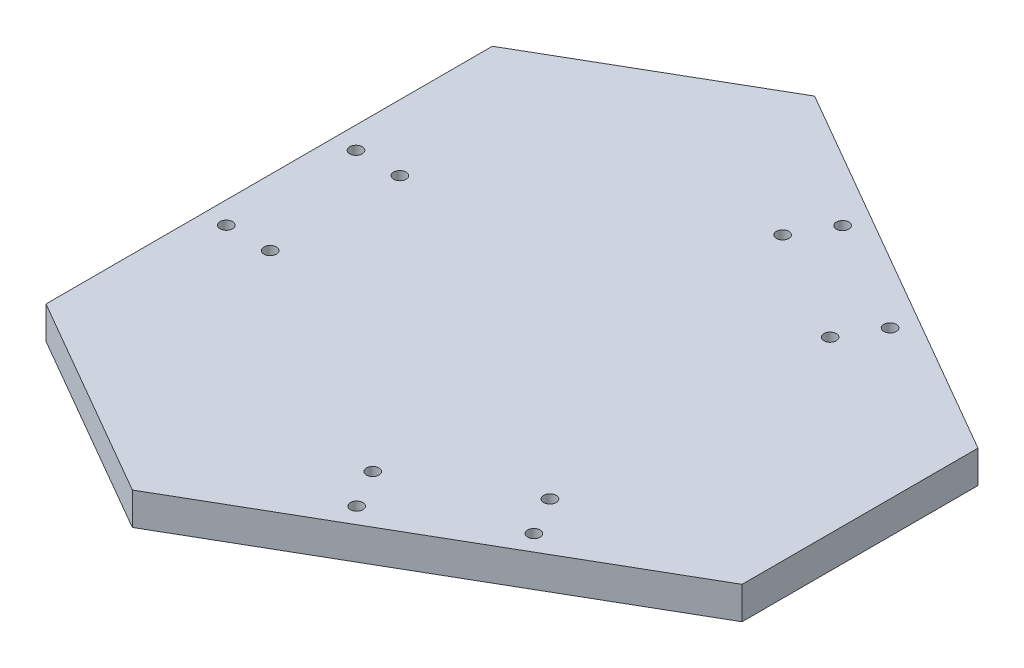
ISO-10303-21;
HEADER;
FILE_DESCRIPTION(('STEP AP214'),'2;1');
FILE_NAME('part.step','',(''),(''),'','','');
FILE_SCHEMA(('AUTOMOTIVE_DESIGN { 1 0 10303 214 1 1 1 1 }'));
ENDSEC;
DATA;
#1=APPLICATION_CONTEXT('core data for automotive mechanical design processes');
#2=APPLICATION_PROTOCOL_DEFINITION('international standard','automotive_design',2000,#1);
#3=PRODUCT_CONTEXT('',#1,'mechanical');
#4=PRODUCT('Part','Part','',(#3));
#5=PRODUCT_RELATED_PRODUCT_CATEGORY('part','',(#4));
#6=PRODUCT_DEFINITION_FORMATION('','',#4);
#7=PRODUCT_DEFINITION_CONTEXT('part definition',#1,'design');
#8=PRODUCT_DEFINITION('design','',#6,#7);
#9=PRODUCT_DEFINITION_SHAPE('','',#8);
#10=(LENGTH_UNIT() NAMED_UNIT(*) SI_UNIT(.MILLI.,.METRE.));
#11=(NAMED_UNIT(*) PLANE_ANGLE_UNIT() SI_UNIT($,.RADIAN.));
#12=(NAMED_UNIT(*) SI_UNIT($,.STERADIAN.) SOLID_ANGLE_UNIT());
#13=UNCERTAINTY_MEASURE_WITH_UNIT(LENGTH_MEASURE(1.E-05),#10,'distance_accuracy_value','');
#14=(GEOMETRIC_REPRESENTATION_CONTEXT(3) GLOBAL_UNCERTAINTY_ASSIGNED_CONTEXT((#13)) GLOBAL_UNIT_ASSIGNED_CONTEXT((#10,
#11,#12)) REPRESENTATION_CONTEXT('',''));
#15=CARTESIAN_POINT('',(0.,0.,0.));
#16=DIRECTION('',(0.,0.,1.));
#17=DIRECTION('',(1.,0.,0.));
#18=AXIS2_PLACEMENT_3D('',#15,#16,#17);
#19=CARTESIAN_POINT('',(0.,12.7,0.));
#20=DIRECTION('',(0.,-1.,0.));
#21=DIRECTION('',(0.,0.,-1.));
#22=AXIS2_PLACEMENT_3D('',#19,#20,#21);
#23=PLANE('',#22);
#24=DIRECTION('',(-0.866025403784441,0.,-0.499999999999996));
#25=VECTOR('',#24,1.);
#26=CARTESIAN_POINT('',(-23.7919903784448,12.7,-133.584979218994));
#27=LINE('',#26,#25);
#28=CARTESIAN_POINT('',(127.583980756887,12.7,-46.1880215351699));
#29=VERTEX_POINT('',#28);
#30=CARTESIAN_POINT('',(-23.7919903784448,12.7,-133.584979218994));
#31=VERTEX_POINT('',#30);
#32=EDGE_CURVE('E152',#29,#31,#27,.T.);
#33=ORIENTED_EDGE('',*,*,#32,.T.);
#34=DIRECTION('',(-0.866025403784434,0.,0.500000000000007));
#35=VECTOR('',#34,1.);
#36=CARTESIAN_POINT('',(-23.7919903784448,12.7,-133.584979218994));
#37=LINE('',#36,#35);
#38=CARTESIAN_POINT('',(-103.791990378444,12.7,-87.3969576838233));
#39=VERTEX_POINT('',#38);
#40=EDGE_CURVE('E100',#31,#39,#37,.T.);
#41=ORIENTED_EDGE('',*,*,#40,.T.);
#42=DIRECTION('',(0.,0.,1.));
#43=VECTOR('',#42,1.);
#44=CARTESIAN_POINT('',(-103.791990378444,12.7,-87.3969576838233));
#45=LINE('',#44,#43);
#46=CARTESIAN_POINT('',(-103.791990378443,12.7,87.3969576838251));
#47=VERTEX_POINT('',#46);
#48=EDGE_CURVE('E113',#39,#47,#45,.T.);
#49=ORIENTED_EDGE('',*,*,#48,.T.);
#50=DIRECTION('',(0.866025403784443,0.,0.499999999999992));
#51=VECTOR('',#50,1.);
#52=CARTESIAN_POINT('',(-103.791990378443,12.7,87.3969576838251));
#53=LINE('',#52,#51);
#54=CARTESIAN_POINT('',(-23.7919903784425,12.7,133.584979218994));
#55=VERTEX_POINT('',#54);
#56=EDGE_CURVE('E107',#47,#55,#53,.T.);
#57=ORIENTED_EDGE('',*,*,#56,.T.);
#58=DIRECTION('',(0.866025403784436,0.,-0.500000000000004));
#59=VECTOR('',#58,1.);
#60=CARTESIAN_POINT('',(-23.7919903784425,12.7,133.584979218994));
#61=LINE('',#60,#59);
#62=CARTESIAN_POINT('',(127.583980756887,12.7,46.1880215351699));
#63=VERTEX_POINT('',#62);
#64=EDGE_CURVE('E111',#55,#63,#61,.T.);
#65=ORIENTED_EDGE('',*,*,#64,.T.);
#66=DIRECTION('',(0.,0.,-1.));
#67=VECTOR('',#66,1.);
#68=CARTESIAN_POINT('',(127.583980756887,12.7,-46.1880215351699));
#69=LINE('',#68,#67);
#70=EDGE_CURVE('E63',#63,#29,#69,.T.);
#71=ORIENTED_EDGE('',*,*,#70,.T.);
#72=EDGE_LOOP('',(#33,#41,#49,#57,#65,#71));
#73=FACE_BOUND('',#72,.T.);
#74=CARTESIAN_POINT('',(69.5963939228782,12.7,69.7451759231105));
#75=DIRECTION('',(0.,1.,0.));
#76=DIRECTION('',(0.,0.,1.));
#77=AXIS2_PLACEMENT_3D('',#74,#75,#76);
#78=CIRCLE('',#77,2.4511);
#79=CARTESIAN_POINT('',(69.5963939228782,12.7,72.1962759231105));
#80=VERTEX_POINT('',#79);
#81=EDGE_CURVE('E140',#80,#80,#78,.T.);
#82=ORIENTED_EDGE('',*,*,#81,.F.);
#83=EDGE_LOOP('',(#82));
#84=FACE_BOUND('',#83,.T.);
#85=CARTESIAN_POINT('',(25.6028971793903,12.7,95.1448331105564));
#86=DIRECTION('',(0.,1.,0.));
#87=DIRECTION('',(0.,0.,-1.));
#88=AXIS2_PLACEMENT_3D('',#85,#86,#87);
#89=CIRCLE('',#88,2.4511);
#90=CARTESIAN_POINT('',(25.6028971793903,12.7,92.6937331105564));
#91=VERTEX_POINT('',#90);
#92=EDGE_CURVE('E320',#91,#91,#89,.T.);
#93=ORIENTED_EDGE('',*,*,#92,.F.);
#94=EDGE_LOOP('',(#93));
#95=FACE_BOUND('',#94,.T.);
#96=CARTESIAN_POINT('',(60.9996431990551,12.7,54.8551668894447));
#97=DIRECTION('',(0.,1.,0.));
#98=DIRECTION('',(0.,0.,-1.));
#99=AXIS2_PLACEMENT_3D('',#96,#97,#98);
#100=CIRCLE('',#99,2.4511);
#101=CARTESIAN_POINT('',(60.9996431990551,12.7,52.4040668894447));
#102=VERTEX_POINT('',#101);
#103=EDGE_CURVE('E312',#102,#102,#100,.T.);
#104=ORIENTED_EDGE('',*,*,#103,.F.);
#105=EDGE_LOOP('',(#104));
#106=FACE_BOUND('',#105,.T.);
#107=CARTESIAN_POINT('',(17.0061464555673,12.7,80.2548240768907));
#108=DIRECTION('',(0.,1.,0.));
#109=DIRECTION('',(0.,0.,1.));
#110=AXIS2_PLACEMENT_3D('',#107,#108,#109);
#111=CIRCLE('',#110,2.4511);
#112=CARTESIAN_POINT('',(17.0061464555673,12.7,82.7059240768907));
#113=VERTEX_POINT('',#112);
#114=EDGE_CURVE('E304',#113,#113,#111,.T.);
#115=ORIENTED_EDGE('',*,*,#114,.F.);
#116=EDGE_LOOP('',(#115));
#117=FACE_BOUND('',#116,.T.);
#118=CARTESIAN_POINT('',(-78.0057896546217,12.7,25.3996571874461));
#119=DIRECTION('',(0.,1.,0.));
#120=DIRECTION('',(0.,0.,-1.));
#121=AXIS2_PLACEMENT_3D('',#118,#119,#120);
#122=CIRCLE('',#121,2.4511);
#123=CARTESIAN_POINT('',(-78.0057896546217,12.7,22.9485571874461));
#124=VERTEX_POINT('',#123);
#125=EDGE_CURVE('E296',#124,#124,#122,.T.);
#126=ORIENTED_EDGE('',*,*,#125,.F.);
#127=EDGE_LOOP('',(#126));
#128=FACE_BOUND('',#127,.T.);
#129=CARTESIAN_POINT('',(-95.1992911022676,12.7,25.3996571874461));
#130=DIRECTION('',(0.,1.,0.));
#131=DIRECTION('',(0.,0.,1.));
#132=AXIS2_PLACEMENT_3D('',#129,#130,#131);
#133=CIRCLE('',#132,2.4511);
#134=CARTESIAN_POINT('',(-95.1992911022676,12.7,27.8507571874461));
#135=VERTEX_POINT('',#134);
#136=EDGE_CURVE('E288',#135,#135,#133,.T.);
#137=ORIENTED_EDGE('',*,*,#136,.F.);
#138=EDGE_LOOP('',(#137));
#139=FACE_BOUND('',#138,.T.);
#140=CARTESIAN_POINT('',(-95.1992911022678,12.7,-25.3996571874453));
#141=DIRECTION('',(0.,1.,0.));
#142=DIRECTION('',(0.,0.,-1.));
#143=AXIS2_PLACEMENT_3D('',#140,#141,#142);
#144=CIRCLE('',#143,2.4511);
#145=CARTESIAN_POINT('',(-95.1992911022678,12.7,-27.8507571874453));
#146=VERTEX_POINT('',#145);
#147=EDGE_CURVE('E280',#146,#146,#144,.T.);
#148=ORIENTED_EDGE('',*,*,#147,.F.);
#149=EDGE_LOOP('',(#148));
#150=FACE_BOUND('',#149,.T.);
#151=CARTESIAN_POINT('',(-78.0057896546219,12.7,-25.3996571874453));
#152=DIRECTION('',(0.,1.,0.));
#153=DIRECTION('',(0.,0.,1.));
#154=AXIS2_PLACEMENT_3D('',#151,#152,#153);
#155=CIRCLE('',#154,2.4511);
#156=CARTESIAN_POINT('',(-78.0057896546219,12.7,-22.9485571874453));
#157=VERTEX_POINT('',#156);
#158=EDGE_CURVE('E272',#157,#157,#155,.T.);
#159=ORIENTED_EDGE('',*,*,#158,.F.);
#160=EDGE_LOOP('',(#159));
#161=FACE_BOUND('',#160,.T.);
#162=CARTESIAN_POINT('',(60.9996431990543,12.7,-54.8551668894456));
#163=DIRECTION('',(0.,1.,0.));
#164=DIRECTION('',(0.,0.,1.));
#165=AXIS2_PLACEMENT_3D('',#162,#163,#164);
#166=CIRCLE('',#165,2.4511);
#167=CARTESIAN_POINT('',(60.9996431990543,12.7,-52.4040668894456));
#168=VERTEX_POINT('',#167);
#169=EDGE_CURVE('E264',#168,#168,#166,.T.);
#170=ORIENTED_EDGE('',*,*,#169,.F.);
#171=EDGE_LOOP('',(#170));
#172=FACE_BOUND('',#171,.T.);
#173=CARTESIAN_POINT('',(69.5963939228772,12.7,-69.7451759231115));
#174=DIRECTION('',(0.,1.,0.));
#175=DIRECTION('',(0.,0.,-1.));
#176=AXIS2_PLACEMENT_3D('',#173,#174,#175);
#177=CIRCLE('',#176,2.4511);
#178=CARTESIAN_POINT('',(69.5963939228772,12.7,-72.1962759231115));
#179=VERTEX_POINT('',#178);
#180=EDGE_CURVE('E256',#179,#179,#177,.T.);
#181=ORIENTED_EDGE('',*,*,#180,.F.);
#182=EDGE_LOOP('',(#181));
#183=FACE_BOUND('',#182,.T.);
#184=CARTESIAN_POINT('',(25.602897179389,12.7,-95.1448331105568));
#185=DIRECTION('',(0.,1.,0.));
#186=DIRECTION('',(0.,0.,1.));
#187=AXIS2_PLACEMENT_3D('',#184,#185,#186);
#188=CIRCLE('',#187,2.4511);
#189=CARTESIAN_POINT('',(25.602897179389,12.7,-92.6937331105568));
#190=VERTEX_POINT('',#189);
#191=EDGE_CURVE('E248',#190,#190,#188,.T.);
#192=ORIENTED_EDGE('',*,*,#191,.F.);
#193=EDGE_LOOP('',(#192));
#194=FACE_BOUND('',#193,.T.);
#195=CARTESIAN_POINT('',(17.0061464555662,12.7,-80.2548240768909));
#196=DIRECTION('',(0.,1.,0.));
#197=DIRECTION('',(0.,0.,-1.));
#198=AXIS2_PLACEMENT_3D('',#195,#196,#197);
#199=CIRCLE('',#198,2.4511);
#200=CARTESIAN_POINT('',(17.0061464555662,12.7,-82.7059240768909));
#201=VERTEX_POINT('',#200);
#202=EDGE_CURVE('E237',#201,#201,#199,.T.);
#203=ORIENTED_EDGE('',*,*,#202,.F.);
#204=EDGE_LOOP('',(#203));
#205=FACE_BOUND('',#204,.T.);
#206=ADVANCED_FACE('F45',(#73,#84,#95,#106,#117,#128,#139,#150,#161,#172,#183,#194,#205),#23,.F.);
#207=CARTESIAN_POINT('',(0.,0.,0.));
#208=DIRECTION('',(0.,-1.,0.));
#209=DIRECTION('',(0.,0.,-1.));
#210=AXIS2_PLACEMENT_3D('',#207,#208,#209);
#211=PLANE('',#210);
#212=CARTESIAN_POINT('',(25.602897179389,0.,-95.1448331105568));
#213=DIRECTION('',(0.,1.,0.));
#214=DIRECTION('',(0.,0.,1.));
#215=AXIS2_PLACEMENT_3D('',#212,#213,#214);
#216=CIRCLE('',#215,2.4511);
#217=CARTESIAN_POINT('',(25.602897179389,0.,-92.6937331105568));
#218=VERTEX_POINT('',#217);
#219=EDGE_CURVE('E245',#218,#218,#216,.T.);
#220=ORIENTED_EDGE('',*,*,#219,.T.);
#221=EDGE_LOOP('',(#220));
#222=FACE_BOUND('',#221,.T.);
#223=CARTESIAN_POINT('',(60.9996431990543,0.,-54.8551668894456));
#224=DIRECTION('',(0.,1.,0.));
#225=DIRECTION('',(0.,0.,1.));
#226=AXIS2_PLACEMENT_3D('',#223,#224,#225);
#227=CIRCLE('',#226,2.4511);
#228=CARTESIAN_POINT('',(60.9996431990543,0.,-52.4040668894456));
#229=VERTEX_POINT('',#228);
#230=EDGE_CURVE('E260',#229,#229,#227,.T.);
#231=ORIENTED_EDGE('',*,*,#230,.T.);
#232=EDGE_LOOP('',(#231));
#233=FACE_BOUND('',#232,.T.);
#234=CARTESIAN_POINT('',(-95.1992911022678,0.,-25.3996571874453));
#235=DIRECTION('',(0.,1.,0.));
#236=DIRECTION('',(0.,0.,-1.));
#237=AXIS2_PLACEMENT_3D('',#234,#235,#236);
#238=CIRCLE('',#237,2.4511);
#239=CARTESIAN_POINT('',(-95.1992911022678,0.,-27.8507571874453));
#240=VERTEX_POINT('',#239);
#241=EDGE_CURVE('E276',#240,#240,#238,.T.);
#242=ORIENTED_EDGE('',*,*,#241,.T.);
#243=EDGE_LOOP('',(#242));
#244=FACE_BOUND('',#243,.T.);
#245=CARTESIAN_POINT('',(-78.0057896546217,0.,25.3996571874461));
#246=DIRECTION('',(0.,1.,0.));
#247=DIRECTION('',(0.,0.,-1.));
#248=AXIS2_PLACEMENT_3D('',#245,#246,#247);
#249=CIRCLE('',#248,2.4511);
#250=CARTESIAN_POINT('',(-78.0057896546217,0.,22.9485571874461));
#251=VERTEX_POINT('',#250);
#252=EDGE_CURVE('E292',#251,#251,#249,.T.);
#253=ORIENTED_EDGE('',*,*,#252,.T.);
#254=EDGE_LOOP('',(#253));
#255=FACE_BOUND('',#254,.T.);
#256=CARTESIAN_POINT('',(60.9996431990551,0.,54.8551668894447));
#257=DIRECTION('',(0.,1.,0.));
#258=DIRECTION('',(0.,0.,-1.));
#259=AXIS2_PLACEMENT_3D('',#256,#257,#258);
#260=CIRCLE('',#259,2.4511);
#261=CARTESIAN_POINT('',(60.9996431990551,0.,52.4040668894447));
#262=VERTEX_POINT('',#261);
#263=EDGE_CURVE('E308',#262,#262,#260,.T.);
#264=ORIENTED_EDGE('',*,*,#263,.T.);
#265=EDGE_LOOP('',(#264));
#266=FACE_BOUND('',#265,.T.);
#267=CARTESIAN_POINT('',(69.5963939228782,0.,69.7451759231105));
#268=DIRECTION('',(0.,1.,0.));
#269=DIRECTION('',(0.,0.,1.));
#270=AXIS2_PLACEMENT_3D('',#267,#268,#269);
#271=CIRCLE('',#270,2.4511);
#272=CARTESIAN_POINT('',(69.5963939228782,0.,72.1962759231105));
#273=VERTEX_POINT('',#272);
#274=EDGE_CURVE('E324',#273,#273,#271,.T.);
#275=ORIENTED_EDGE('',*,*,#274,.T.);
#276=EDGE_LOOP('',(#275));
#277=FACE_BOUND('',#276,.T.);
#278=DIRECTION('',(-0.866025403784441,0.,-0.499999999999996));
#279=VECTOR('',#278,1.);
#280=CARTESIAN_POINT('',(-23.7919903784448,0.,-133.584979218994));
#281=LINE('',#280,#279);
#282=CARTESIAN_POINT('',(127.583980756887,0.,-46.1880215351699));
#283=VERTEX_POINT('',#282);
#284=CARTESIAN_POINT('',(-23.7919903784448,0.,-133.584979218994));
#285=VERTEX_POINT('',#284);
#286=EDGE_CURVE('E135',#283,#285,#281,.T.);
#287=ORIENTED_EDGE('',*,*,#286,.F.);
#288=DIRECTION('',(0.,0.,-1.));
#289=VECTOR('',#288,1.);
#290=CARTESIAN_POINT('',(127.583980756887,0.,-46.1880215351699));
#291=LINE('',#290,#289);
#292=CARTESIAN_POINT('',(127.583980756887,0.,46.1880215351699));
#293=VERTEX_POINT('',#292);
#294=EDGE_CURVE('E92',#293,#283,#291,.T.);
#295=ORIENTED_EDGE('',*,*,#294,.F.);
#296=DIRECTION('',(0.866025403784436,0.,-0.500000000000004));
#297=VECTOR('',#296,1.);
#298=CARTESIAN_POINT('',(-23.7919903784425,0.,133.584979218994));
#299=LINE('',#298,#297);
#300=CARTESIAN_POINT('',(-23.7919903784425,0.,133.584979218994));
#301=VERTEX_POINT('',#300);
#302=EDGE_CURVE('E86',#301,#293,#299,.T.);
#303=ORIENTED_EDGE('',*,*,#302,.F.);
#304=DIRECTION('',(0.866025403784443,0.,0.499999999999992));
#305=VECTOR('',#304,1.);
#306=CARTESIAN_POINT('',(-103.791990378443,0.,87.3969576838251));
#307=LINE('',#306,#305);
#308=CARTESIAN_POINT('',(-103.791990378443,0.,87.3969576838251));
#309=VERTEX_POINT('',#308);
#310=EDGE_CURVE('E122',#309,#301,#307,.T.);
#311=ORIENTED_EDGE('',*,*,#310,.F.);
#312=DIRECTION('',(0.,0.,1.));
#313=VECTOR('',#312,1.);
#314=CARTESIAN_POINT('',(-103.791990378444,0.,-87.3969576838233));
#315=LINE('',#314,#313);
#316=CARTESIAN_POINT('',(-103.791990378444,0.,-87.3969576838233));
#317=VERTEX_POINT('',#316);
#318=EDGE_CURVE('E143',#317,#309,#315,.T.);
#319=ORIENTED_EDGE('',*,*,#318,.F.);
#320=DIRECTION('',(-0.866025403784434,0.,0.500000000000007));
#321=VECTOR('',#320,1.);
#322=CARTESIAN_POINT('',(-23.7919903784448,0.,-133.584979218994));
#323=LINE('',#322,#321);
#324=EDGE_CURVE('E139',#285,#317,#323,.T.);
#325=ORIENTED_EDGE('',*,*,#324,.F.);
#326=EDGE_LOOP('',(#287,#295,#303,#311,#319,#325));
#327=FACE_BOUND('',#326,.T.);
#328=CARTESIAN_POINT('',(25.6028971793903,0.,95.1448331105564));
#329=DIRECTION('',(0.,1.,0.));
#330=DIRECTION('',(0.,0.,-1.));
#331=AXIS2_PLACEMENT_3D('',#328,#329,#330);
#332=CIRCLE('',#331,2.4511);
#333=CARTESIAN_POINT('',(25.6028971793903,0.,92.6937331105564));
#334=VERTEX_POINT('',#333);
#335=EDGE_CURVE('E316',#334,#334,#332,.T.);
#336=ORIENTED_EDGE('',*,*,#335,.T.);
#337=EDGE_LOOP('',(#336));
#338=FACE_BOUND('',#337,.T.);
#339=CARTESIAN_POINT('',(17.0061464555673,0.,80.2548240768907));
#340=DIRECTION('',(0.,1.,0.));
#341=DIRECTION('',(0.,0.,1.));
#342=AXIS2_PLACEMENT_3D('',#339,#340,#341);
#343=CIRCLE('',#342,2.4511);
#344=CARTESIAN_POINT('',(17.0061464555673,0.,82.7059240768907));
#345=VERTEX_POINT('',#344);
#346=EDGE_CURVE('E300',#345,#345,#343,.T.);
#347=ORIENTED_EDGE('',*,*,#346,.T.);
#348=EDGE_LOOP('',(#347));
#349=FACE_BOUND('',#348,.T.);
#350=CARTESIAN_POINT('',(-95.1992911022676,0.,25.3996571874461));
#351=DIRECTION('',(0.,1.,0.));
#352=DIRECTION('',(0.,0.,1.));
#353=AXIS2_PLACEMENT_3D('',#350,#351,#352);
#354=CIRCLE('',#353,2.4511);
#355=CARTESIAN_POINT('',(-95.1992911022676,0.,27.8507571874461));
#356=VERTEX_POINT('',#355);
#357=EDGE_CURVE('E284',#356,#356,#354,.T.);
#358=ORIENTED_EDGE('',*,*,#357,.T.);
#359=EDGE_LOOP('',(#358));
#360=FACE_BOUND('',#359,.T.);
#361=CARTESIAN_POINT('',(-78.0057896546219,0.,-25.3996571874453));
#362=DIRECTION('',(0.,1.,0.));
#363=DIRECTION('',(0.,0.,1.));
#364=AXIS2_PLACEMENT_3D('',#361,#362,#363);
#365=CIRCLE('',#364,2.4511);
#366=CARTESIAN_POINT('',(-78.0057896546219,0.,-22.9485571874453));
#367=VERTEX_POINT('',#366);
#368=EDGE_CURVE('E268',#367,#367,#365,.T.);
#369=ORIENTED_EDGE('',*,*,#368,.T.);
#370=EDGE_LOOP('',(#369));
#371=FACE_BOUND('',#370,.T.);
#372=CARTESIAN_POINT('',(69.5963939228772,0.,-69.7451759231115));
#373=DIRECTION('',(0.,1.,0.));
#374=DIRECTION('',(0.,0.,-1.));
#375=AXIS2_PLACEMENT_3D('',#372,#373,#374);
#376=CIRCLE('',#375,2.4511);
#377=CARTESIAN_POINT('',(69.5963939228772,0.,-72.1962759231115));
#378=VERTEX_POINT('',#377);
#379=EDGE_CURVE('E252',#378,#378,#376,.T.);
#380=ORIENTED_EDGE('',*,*,#379,.T.);
#381=EDGE_LOOP('',(#380));
#382=FACE_BOUND('',#381,.T.);
#383=CARTESIAN_POINT('',(17.0061464555662,0.,-80.2548240768909));
#384=DIRECTION('',(0.,1.,0.));
#385=DIRECTION('',(0.,0.,-1.));
#386=AXIS2_PLACEMENT_3D('',#383,#384,#385);
#387=CIRCLE('',#386,2.4511);
#388=CARTESIAN_POINT('',(17.0061464555662,0.,-82.7059240768909));
#389=VERTEX_POINT('',#388);
#390=EDGE_CURVE('E240',#389,#389,#387,.T.);
#391=ORIENTED_EDGE('',*,*,#390,.T.);
#392=EDGE_LOOP('',(#391));
#393=FACE_BOUND('',#392,.T.);
#394=ADVANCED_FACE('F165',(#222,#233,#244,#255,#266,#277,#327,#338,#349,#360,#371,#382,#393),
#211,.T.);
#395=CARTESIAN_POINT('',(-23.7919903784448,12.7,-133.584979218994));
#396=DIRECTION('',(-0.499999999999996,0.,0.866025403784441));
#397=DIRECTION('',(0.866025403784441,0.,0.499999999999996));
#398=AXIS2_PLACEMENT_3D('',#395,#396,#397);
#399=PLANE('',#398);
#400=ORIENTED_EDGE('',*,*,#286,.T.);
#401=DIRECTION('',(0.,-1.,0.));
#402=VECTOR('',#401,1.);
#403=CARTESIAN_POINT('',(-23.7919903784448,12.7,-133.584979218994));
#404=LINE('',#403,#402);
#405=EDGE_CURVE('E11',#31,#285,#404,.T.);
#406=ORIENTED_EDGE('',*,*,#405,.F.);
#407=ORIENTED_EDGE('',*,*,#32,.F.);
#408=DIRECTION('',(0.,-1.,0.));
#409=VECTOR('',#408,1.);
#410=CARTESIAN_POINT('',(127.583980756887,12.7,-46.1880215351699));
#411=LINE('',#410,#409);
#412=EDGE_CURVE('E131',#29,#283,#411,.T.);
#413=ORIENTED_EDGE('',*,*,#412,.T.);
#414=EDGE_LOOP('',(#400,#406,#407,#413));
#415=FACE_BOUND('',#414,.T.);
#416=ADVANCED_FACE('F47',(#415),#399,.F.);
#417=CARTESIAN_POINT('',(-23.7919903784448,12.7,-133.584979218994));
#418=DIRECTION('',(0.500000000000007,0.,0.866025403784434));
#419=DIRECTION('',(0.866025403784435,0.,-0.500000000000007));
#420=AXIS2_PLACEMENT_3D('',#417,#418,#419);
#421=PLANE('',#420);
#422=ORIENTED_EDGE('',*,*,#324,.T.);
#423=DIRECTION('',(0.,-1.,0.));
#424=VECTOR('',#423,1.);
#425=CARTESIAN_POINT('',(-103.791990378444,12.7,-87.3969576838233));
#426=LINE('',#425,#424);
#427=EDGE_CURVE('E55',#39,#317,#426,.T.);
#428=ORIENTED_EDGE('',*,*,#427,.F.);
#429=ORIENTED_EDGE('',*,*,#40,.F.);
#430=ORIENTED_EDGE('',*,*,#405,.T.);
#431=EDGE_LOOP('',(#422,#428,#429,#430));
#432=FACE_BOUND('',#431,.T.);
#433=ADVANCED_FACE('F466',(#432),#421,.F.);
#434=CARTESIAN_POINT('',(-103.791990378444,12.7,-87.3969576838233));
#435=DIRECTION('',(1.,0.,0.));
#436=DIRECTION('',(0.,0.,-1.));
#437=AXIS2_PLACEMENT_3D('',#434,#435,#436);
#438=PLANE('',#437);
#439=ORIENTED_EDGE('',*,*,#318,.T.);
#440=DIRECTION('',(0.,-1.,0.));
#441=VECTOR('',#440,1.);
#442=CARTESIAN_POINT('',(-103.791990378443,12.7,87.3969576838251));
#443=LINE('',#442,#441);
#444=EDGE_CURVE('E124',#47,#309,#443,.T.);
#445=ORIENTED_EDGE('',*,*,#444,.F.);
#446=ORIENTED_EDGE('',*,*,#48,.F.);
#447=ORIENTED_EDGE('',*,*,#427,.T.);
#448=EDGE_LOOP('',(#439,#445,#446,#447));
#449=FACE_BOUND('',#448,.T.);
#450=ADVANCED_FACE('F162',(#449),#438,.F.);
#451=CARTESIAN_POINT('',(-103.791990378443,12.7,87.3969576838251));
#452=DIRECTION('',(0.499999999999992,0.,-0.866025403784443));
#453=DIRECTION('',(-0.866025403784443,0.,-0.499999999999992));
#454=AXIS2_PLACEMENT_3D('',#451,#452,#453);
#455=PLANE('',#454);
#456=ORIENTED_EDGE('',*,*,#310,.T.);
#457=DIRECTION('',(0.,-1.,0.));
#458=VECTOR('',#457,1.);
#459=CARTESIAN_POINT('',(-23.7919903784425,12.7,133.584979218994));
#460=LINE('',#459,#458);
#461=EDGE_CURVE('E119',#55,#301,#460,.T.);
#462=ORIENTED_EDGE('',*,*,#461,.F.);
#463=ORIENTED_EDGE('',*,*,#56,.F.);
#464=ORIENTED_EDGE('',*,*,#444,.T.);
#465=EDGE_LOOP('',(#456,#462,#463,#464));
#466=FACE_BOUND('',#465,.T.);
#467=ADVANCED_FACE('F120',(#466),#455,.F.);
#468=CARTESIAN_POINT('',(-23.7919903784425,12.7,133.584979218994));
#469=DIRECTION('',(-0.500000000000004,0.,-0.866025403784436));
#470=DIRECTION('',(-0.866025403784436,0.,0.500000000000004));
#471=AXIS2_PLACEMENT_3D('',#468,#469,#470);
#472=PLANE('',#471);
#473=ORIENTED_EDGE('',*,*,#302,.T.);
#474=DIRECTION('',(0.,-1.,0.));
#475=VECTOR('',#474,1.);
#476=CARTESIAN_POINT('',(127.583980756887,12.7,46.1880215351699));
#477=LINE('',#476,#475);
#478=EDGE_CURVE('E125',#63,#293,#477,.T.);
#479=ORIENTED_EDGE('',*,*,#478,.F.);
#480=ORIENTED_EDGE('',*,*,#64,.F.);
#481=ORIENTED_EDGE('',*,*,#461,.T.);
#482=EDGE_LOOP('',(#473,#479,#480,#481));
#483=FACE_BOUND('',#482,.T.);
#484=ADVANCED_FACE('F127',(#483),#472,.F.);
#485=CARTESIAN_POINT('',(127.583980756887,12.7,-46.1880215351699));
#486=DIRECTION('',(-1.,0.,0.));
#487=DIRECTION('',(0.,0.,1.));
#488=AXIS2_PLACEMENT_3D('',#485,#486,#487);
#489=PLANE('',#488);
#490=ORIENTED_EDGE('',*,*,#294,.T.);
#491=ORIENTED_EDGE('',*,*,#412,.F.);
#492=ORIENTED_EDGE('',*,*,#70,.F.);
#493=ORIENTED_EDGE('',*,*,#478,.T.);
#494=EDGE_LOOP('',(#490,#491,#492,#493));
#495=FACE_BOUND('',#494,.T.);
#496=ADVANCED_FACE('F170',(#495),#489,.F.);
#497=CARTESIAN_POINT('',(69.5963939228782,12.7,69.7451759231105));
#498=DIRECTION('',(0.,-1.,0.));
#499=DIRECTION('',(0.,0.,-1.));
#500=AXIS2_PLACEMENT_3D('',#497,#498,#499);
#501=CYLINDRICAL_SURFACE('',#500,2.4511);
#502=ORIENTED_EDGE('',*,*,#81,.T.);
#503=EDGE_LOOP('',(#502));
#504=FACE_BOUND('',#503,.T.);
#505=ORIENTED_EDGE('',*,*,#274,.F.);
#506=EDGE_LOOP('',(#505));
#507=FACE_BOUND('',#506,.T.);
#508=ADVANCED_FACE('F172',(#504,#507),#501,.F.);
#509=CARTESIAN_POINT('',(25.6028971793903,12.7,95.1448331105564));
#510=DIRECTION('',(0.,-1.,0.));
#511=DIRECTION('',(0.,0.,-1.));
#512=AXIS2_PLACEMENT_3D('',#509,#510,#511);
#513=CYLINDRICAL_SURFACE('',#512,2.4511);
#514=ORIENTED_EDGE('',*,*,#92,.T.);
#515=EDGE_LOOP('',(#514));
#516=FACE_BOUND('',#515,.T.);
#517=ORIENTED_EDGE('',*,*,#335,.F.);
#518=EDGE_LOOP('',(#517));
#519=FACE_BOUND('',#518,.T.);
#520=ADVANCED_FACE('F178',(#516,#519),#513,.F.);
#521=CARTESIAN_POINT('',(60.9996431990551,12.7,54.8551668894447));
#522=DIRECTION('',(0.,-1.,0.));
#523=DIRECTION('',(0.,0.,-1.));
#524=AXIS2_PLACEMENT_3D('',#521,#522,#523);
#525=CYLINDRICAL_SURFACE('',#524,2.4511);
#526=ORIENTED_EDGE('',*,*,#103,.T.);
#527=EDGE_LOOP('',(#526));
#528=FACE_BOUND('',#527,.T.);
#529=ORIENTED_EDGE('',*,*,#263,.F.);
#530=EDGE_LOOP('',(#529));
#531=FACE_BOUND('',#530,.T.);
#532=ADVANCED_FACE('F192',(#528,#531),#525,.F.);
#533=CARTESIAN_POINT('',(17.0061464555673,12.7,80.2548240768907));
#534=DIRECTION('',(0.,-1.,0.));
#535=DIRECTION('',(0.,0.,-1.));
#536=AXIS2_PLACEMENT_3D('',#533,#534,#535);
#537=CYLINDRICAL_SURFACE('',#536,2.4511);
#538=ORIENTED_EDGE('',*,*,#114,.T.);
#539=EDGE_LOOP('',(#538));
#540=FACE_BOUND('',#539,.T.);
#541=ORIENTED_EDGE('',*,*,#346,.F.);
#542=EDGE_LOOP('',(#541));
#543=FACE_BOUND('',#542,.T.);
#544=ADVANCED_FACE('F196',(#540,#543),#537,.F.);
#545=CARTESIAN_POINT('',(-78.0057896546217,12.7,25.3996571874461));
#546=DIRECTION('',(0.,-1.,0.));
#547=DIRECTION('',(0.,0.,-1.));
#548=AXIS2_PLACEMENT_3D('',#545,#546,#547);
#549=CYLINDRICAL_SURFACE('',#548,2.4511);
#550=ORIENTED_EDGE('',*,*,#125,.T.);
#551=EDGE_LOOP('',(#550));
#552=FACE_BOUND('',#551,.T.);
#553=ORIENTED_EDGE('',*,*,#252,.F.);
#554=EDGE_LOOP('',(#553));
#555=FACE_BOUND('',#554,.T.);
#556=ADVANCED_FACE('F200',(#552,#555),#549,.F.);
#557=CARTESIAN_POINT('',(-95.1992911022676,12.7,25.3996571874461));
#558=DIRECTION('',(0.,-1.,0.));
#559=DIRECTION('',(0.,0.,-1.));
#560=AXIS2_PLACEMENT_3D('',#557,#558,#559);
#561=CYLINDRICAL_SURFACE('',#560,2.4511);
#562=ORIENTED_EDGE('',*,*,#136,.T.);
#563=EDGE_LOOP('',(#562));
#564=FACE_BOUND('',#563,.T.);
#565=ORIENTED_EDGE('',*,*,#357,.F.);
#566=EDGE_LOOP('',(#565));
#567=FACE_BOUND('',#566,.T.);
#568=ADVANCED_FACE('F204',(#564,#567),#561,.F.);
#569=CARTESIAN_POINT('',(-95.1992911022678,12.7,-25.3996571874453));
#570=DIRECTION('',(0.,-1.,0.));
#571=DIRECTION('',(0.,0.,-1.));
#572=AXIS2_PLACEMENT_3D('',#569,#570,#571);
#573=CYLINDRICAL_SURFACE('',#572,2.4511);
#574=ORIENTED_EDGE('',*,*,#147,.T.);
#575=EDGE_LOOP('',(#574));
#576=FACE_BOUND('',#575,.T.);
#577=ORIENTED_EDGE('',*,*,#241,.F.);
#578=EDGE_LOOP('',(#577));
#579=FACE_BOUND('',#578,.T.);
#580=ADVANCED_FACE('F208',(#576,#579),#573,.F.);
#581=CARTESIAN_POINT('',(-78.0057896546219,12.7,-25.3996571874453));
#582=DIRECTION('',(0.,-1.,0.));
#583=DIRECTION('',(0.,0.,-1.));
#584=AXIS2_PLACEMENT_3D('',#581,#582,#583);
#585=CYLINDRICAL_SURFACE('',#584,2.4511);
#586=ORIENTED_EDGE('',*,*,#158,.T.);
#587=EDGE_LOOP('',(#586));
#588=FACE_BOUND('',#587,.T.);
#589=ORIENTED_EDGE('',*,*,#368,.F.);
#590=EDGE_LOOP('',(#589));
#591=FACE_BOUND('',#590,.T.);
#592=ADVANCED_FACE('F212',(#588,#591),#585,.F.);
#593=CARTESIAN_POINT('',(60.9996431990543,12.7,-54.8551668894456));
#594=DIRECTION('',(0.,-1.,0.));
#595=DIRECTION('',(0.,0.,-1.));
#596=AXIS2_PLACEMENT_3D('',#593,#594,#595);
#597=CYLINDRICAL_SURFACE('',#596,2.4511);
#598=ORIENTED_EDGE('',*,*,#169,.T.);
#599=EDGE_LOOP('',(#598));
#600=FACE_BOUND('',#599,.T.);
#601=ORIENTED_EDGE('',*,*,#230,.F.);
#602=EDGE_LOOP('',(#601));
#603=FACE_BOUND('',#602,.T.);
#604=ADVANCED_FACE('F216',(#600,#603),#597,.F.);
#605=CARTESIAN_POINT('',(69.5963939228772,12.7,-69.7451759231115));
#606=DIRECTION('',(0.,-1.,0.));
#607=DIRECTION('',(0.,0.,-1.));
#608=AXIS2_PLACEMENT_3D('',#605,#606,#607);
#609=CYLINDRICAL_SURFACE('',#608,2.4511);
#610=ORIENTED_EDGE('',*,*,#180,.T.);
#611=EDGE_LOOP('',(#610));
#612=FACE_BOUND('',#611,.T.);
#613=ORIENTED_EDGE('',*,*,#379,.F.);
#614=EDGE_LOOP('',(#613));
#615=FACE_BOUND('',#614,.T.);
#616=ADVANCED_FACE('F220',(#612,#615),#609,.F.);
#617=CARTESIAN_POINT('',(25.602897179389,12.7,-95.1448331105568));
#618=DIRECTION('',(0.,-1.,0.));
#619=DIRECTION('',(0.,0.,-1.));
#620=AXIS2_PLACEMENT_3D('',#617,#618,#619);
#621=CYLINDRICAL_SURFACE('',#620,2.4511);
#622=ORIENTED_EDGE('',*,*,#191,.T.);
#623=EDGE_LOOP('',(#622));
#624=FACE_BOUND('',#623,.T.);
#625=ORIENTED_EDGE('',*,*,#219,.F.);
#626=EDGE_LOOP('',(#625));
#627=FACE_BOUND('',#626,.T.);
#628=ADVANCED_FACE('F224',(#624,#627),#621,.F.);
#629=CARTESIAN_POINT('',(17.0061464555662,12.7,-80.2548240768909));
#630=DIRECTION('',(0.,-1.,0.));
#631=DIRECTION('',(0.,0.,-1.));
#632=AXIS2_PLACEMENT_3D('',#629,#630,#631);
#633=CYLINDRICAL_SURFACE('',#632,2.4511);
#634=ORIENTED_EDGE('',*,*,#202,.T.);
#635=EDGE_LOOP('',(#634));
#636=FACE_BOUND('',#635,.T.);
#637=ORIENTED_EDGE('',*,*,#390,.F.);
#638=EDGE_LOOP('',(#637));
#639=FACE_BOUND('',#638,.T.);
#640=ADVANCED_FACE('F228',(#636,#639),#633,.F.);
#641=CLOSED_SHELL('',(#206,#394,#416,#433,#450,#467,#484,#496,#508,#520,#532,#544,#556,#568,
#580,#592,#604,#616,#628,#640));
#642=MANIFOLD_SOLID_BREP('B2',#641);
#643=ADVANCED_BREP_SHAPE_REPRESENTATION('',(#18,#642),#14);
#644=SHAPE_DEFINITION_REPRESENTATION(#9,#643);
ENDSEC;
END-ISO-10303-21;
